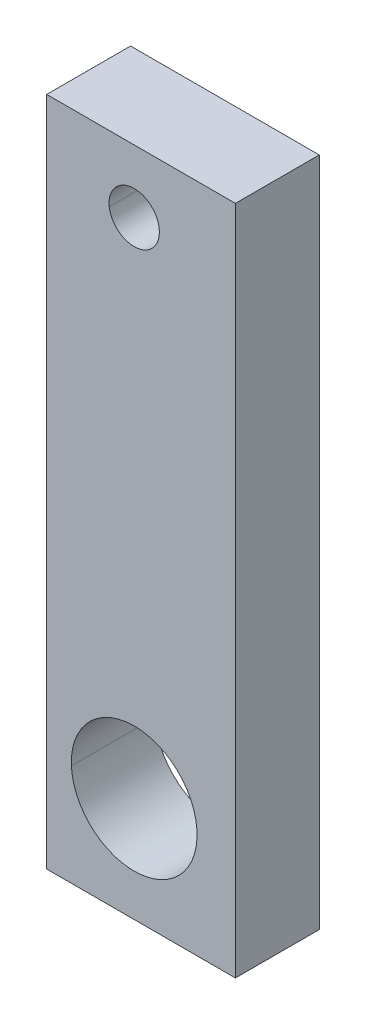
ISO-10303-21;
HEADER;
FILE_DESCRIPTION(('STEP AP214'),'2;1');
FILE_NAME('part.step','',(''),(''),'','','');
FILE_SCHEMA(('AUTOMOTIVE_DESIGN { 1 0 10303 214 1 1 1 1 }'));
ENDSEC;
DATA;
#1=APPLICATION_CONTEXT('core data for automotive mechanical design processes');
#2=APPLICATION_PROTOCOL_DEFINITION('international standard','automotive_design',2000,#1);
#3=PRODUCT_CONTEXT('',#1,'mechanical');
#4=PRODUCT('Part','Part','',(#3));
#5=PRODUCT_RELATED_PRODUCT_CATEGORY('part','',(#4));
#6=PRODUCT_DEFINITION_FORMATION('','',#4);
#7=PRODUCT_DEFINITION_CONTEXT('part definition',#1,'design');
#8=PRODUCT_DEFINITION('design','',#6,#7);
#9=PRODUCT_DEFINITION_SHAPE('','',#8);
#10=(LENGTH_UNIT() NAMED_UNIT(*) SI_UNIT(.MILLI.,.METRE.));
#11=(NAMED_UNIT(*) PLANE_ANGLE_UNIT() SI_UNIT($,.RADIAN.));
#12=(NAMED_UNIT(*) SI_UNIT($,.STERADIAN.) SOLID_ANGLE_UNIT());
#13=UNCERTAINTY_MEASURE_WITH_UNIT(LENGTH_MEASURE(1.E-05),#10,'distance_accuracy_value','');
#14=(GEOMETRIC_REPRESENTATION_CONTEXT(3) GLOBAL_UNCERTAINTY_ASSIGNED_CONTEXT((#13)) GLOBAL_UNIT_ASSIGNED_CONTEXT((#10,
#11,#12)) REPRESENTATION_CONTEXT('',''));
#15=CARTESIAN_POINT('',(0.,0.,0.));
#16=DIRECTION('',(0.,0.,1.));
#17=DIRECTION('',(1.,0.,0.));
#18=AXIS2_PLACEMENT_3D('',#15,#16,#17);
#19=CARTESIAN_POINT('',(20.8621152090657,-135.,20.));
#20=DIRECTION('',(0.,0.,-1.));
#21=DIRECTION('',(-1.,0.,0.));
#22=AXIS2_PLACEMENT_3D('',#19,#20,#21);
#23=CYLINDRICAL_SURFACE('',#22,15.);
#24=CARTESIAN_POINT('',(20.8621152090657,-135.,20.));
#25=DIRECTION('',(0.,0.,1.));
#26=DIRECTION('',(1.,0.,0.));
#27=AXIS2_PLACEMENT_3D('',#24,#25,#26);
#28=CIRCLE('',#27,15.);
#29=CARTESIAN_POINT('',(35.8437607652431,-135.741819674227,20.));
#30=VERTEX_POINT('',#29);
#31=CARTESIAN_POINT('',(5.88046965288826,-135.741819674227,20.));
#32=VERTEX_POINT('',#31);
#33=EDGE_CURVE('E163',#30,#32,#28,.T.);
#34=ORIENTED_EDGE('',*,*,#33,.T.);
#35=DIRECTION('',(0.,0.,-1.));
#36=VECTOR('',#35,1.);
#37=CARTESIAN_POINT('',(5.88046965288826,-135.741819674227,20.));
#38=LINE('',#37,#36);
#39=CARTESIAN_POINT('',(5.88046965288826,-135.741819674227,0.));
#40=VERTEX_POINT('',#39);
#41=EDGE_CURVE('E12',#32,#40,#38,.T.);
#42=ORIENTED_EDGE('',*,*,#41,.T.);
#43=CARTESIAN_POINT('',(20.8621152090657,-135.,0.));
#44=DIRECTION('',(0.,0.,1.));
#45=DIRECTION('',(1.,0.,0.));
#46=AXIS2_PLACEMENT_3D('',#43,#44,#45);
#47=CIRCLE('',#46,15.);
#48=CARTESIAN_POINT('',(35.8437607652431,-135.741819674227,0.));
#49=VERTEX_POINT('',#48);
#50=EDGE_CURVE('E165',#49,#40,#47,.T.);
#51=ORIENTED_EDGE('',*,*,#50,.F.);
#52=DIRECTION('',(0.,0.,-1.));
#53=VECTOR('',#52,1.);
#54=CARTESIAN_POINT('',(35.8437607652431,-135.741819674227,20.));
#55=LINE('',#54,#53);
#56=EDGE_CURVE('E55',#49,#30,#55,.F.);
#57=ORIENTED_EDGE('',*,*,#56,.T.);
#58=EDGE_LOOP('',(#34,#42,#51,#57));
#59=FACE_BOUND('',#58,.T.);
#60=ADVANCED_FACE('F51',(#59),#23,.F.);
#61=CARTESIAN_POINT('',(20.8621152090657,-15.,20.));
#62=DIRECTION('',(0.,0.,-1.));
#63=DIRECTION('',(-1.,0.,0.));
#64=AXIS2_PLACEMENT_3D('',#61,#62,#63);
#65=CYLINDRICAL_SURFACE('',#64,6.);
#66=CARTESIAN_POINT('',(20.8621152090657,-15.,20.));
#67=DIRECTION('',(0.,0.,1.));
#68=DIRECTION('',(1.,0.,0.));
#69=AXIS2_PLACEMENT_3D('',#66,#67,#68);
#70=CIRCLE('',#69,6.);
#71=CARTESIAN_POINT('',(14.9081498437876,-15.7418196742266,20.));
#72=VERTEX_POINT('',#71);
#73=CARTESIAN_POINT('',(26.8160805743437,-15.7418196742266,20.));
#74=VERTEX_POINT('',#73);
#75=EDGE_CURVE('E181',#72,#74,#70,.T.);
#76=ORIENTED_EDGE('',*,*,#75,.T.);
#77=DIRECTION('',(0.,0.,-1.));
#78=VECTOR('',#77,1.);
#79=CARTESIAN_POINT('',(26.8160805743437,-15.7418196742266,20.));
#80=LINE('',#79,#78);
#81=CARTESIAN_POINT('',(26.8160805743437,-15.7418196742266,0.));
#82=VERTEX_POINT('',#81);
#83=EDGE_CURVE('E149',#74,#82,#80,.T.);
#84=ORIENTED_EDGE('',*,*,#83,.T.);
#85=CARTESIAN_POINT('',(20.8621152090657,-15.,0.));
#86=DIRECTION('',(0.,0.,1.));
#87=DIRECTION('',(1.,0.,0.));
#88=AXIS2_PLACEMENT_3D('',#85,#86,#87);
#89=CIRCLE('',#88,6.);
#90=CARTESIAN_POINT('',(14.9081498437876,-15.7418196742266,0.));
#91=VERTEX_POINT('',#90);
#92=EDGE_CURVE('E176',#91,#82,#89,.T.);
#93=ORIENTED_EDGE('',*,*,#92,.F.);
#94=DIRECTION('',(0.,0.,-1.));
#95=VECTOR('',#94,1.);
#96=CARTESIAN_POINT('',(14.9081498437876,-15.7418196742266,20.));
#97=LINE('',#96,#95);
#98=EDGE_CURVE('E145',#91,#72,#97,.F.);
#99=ORIENTED_EDGE('',*,*,#98,.T.);
#100=EDGE_LOOP('',(#76,#84,#93,#99));
#101=FACE_BOUND('',#100,.T.);
#102=ADVANCED_FACE('F226',(#101),#65,.F.);
#103=CARTESIAN_POINT('',(0.,0.,20.));
#104=DIRECTION('',(0.,0.,1.));
#105=DIRECTION('',(1.,0.,0.));
#106=AXIS2_PLACEMENT_3D('',#103,#104,#105);
#107=PLANE('',#106);
#108=ORIENTED_EDGE('',*,*,#75,.F.);
#109=EDGE_CURVE('E183',#74,#72,#70,.T.);
#110=ORIENTED_EDGE('',*,*,#109,.F.);
#111=EDGE_LOOP('',(#108,#110));
#112=FACE_BOUND('',#111,.T.);
#113=DIRECTION('',(0.,-1.,0.));
#114=VECTOR('',#113,1.);
#115=CARTESIAN_POINT('',(0.,0.,20.));
#116=LINE('',#115,#114);
#117=CARTESIAN_POINT('',(0.,0.,20.));
#118=VERTEX_POINT('',#117);
#119=CARTESIAN_POINT('',(0.,-160.,20.));
#120=VERTEX_POINT('',#119);
#121=EDGE_CURVE('E129',#118,#120,#116,.T.);
#122=ORIENTED_EDGE('',*,*,#121,.T.);
#123=DIRECTION('',(1.,0.,0.));
#124=VECTOR('',#123,1.);
#125=CARTESIAN_POINT('',(0.,-160.,20.));
#126=LINE('',#125,#124);
#127=CARTESIAN_POINT('',(45.,-160.,20.));
#128=VERTEX_POINT('',#127);
#129=EDGE_CURVE('E117',#120,#128,#126,.T.);
#130=ORIENTED_EDGE('',*,*,#129,.T.);
#131=DIRECTION('',(0.,1.,0.));
#132=VECTOR('',#131,1.);
#133=CARTESIAN_POINT('',(45.,0.,20.));
#134=LINE('',#133,#132);
#135=CARTESIAN_POINT('',(45.,0.,20.));
#136=VERTEX_POINT('',#135);
#137=EDGE_CURVE('E128',#128,#136,#134,.T.);
#138=ORIENTED_EDGE('',*,*,#137,.T.);
#139=DIRECTION('',(-1.,0.,0.));
#140=VECTOR('',#139,1.);
#141=CARTESIAN_POINT('',(0.,0.,20.));
#142=LINE('',#141,#140);
#143=EDGE_CURVE('E135',#136,#118,#142,.T.);
#144=ORIENTED_EDGE('',*,*,#143,.T.);
#145=EDGE_LOOP('',(#122,#130,#138,#144));
#146=FACE_BOUND('',#145,.T.);
#147=EDGE_CURVE('E167',#32,#30,#28,.T.);
#148=ORIENTED_EDGE('',*,*,#147,.F.);
#149=ORIENTED_EDGE('',*,*,#33,.F.);
#150=EDGE_LOOP('',(#148,#149));
#151=FACE_BOUND('',#150,.T.);
#152=ADVANCED_FACE('F132',(#112,#146,#151),#107,.T.);
#153=CARTESIAN_POINT('',(0.,0.,0.));
#154=DIRECTION('',(0.,0.,1.));
#155=DIRECTION('',(1.,0.,0.));
#156=AXIS2_PLACEMENT_3D('',#153,#154,#155);
#157=PLANE('',#156);
#158=DIRECTION('',(0.,-1.,0.));
#159=VECTOR('',#158,1.);
#160=CARTESIAN_POINT('',(0.,0.,0.));
#161=LINE('',#160,#159);
#162=CARTESIAN_POINT('',(0.,0.,0.));
#163=VERTEX_POINT('',#162);
#164=CARTESIAN_POINT('',(0.,-160.,0.));
#165=VERTEX_POINT('',#164);
#166=EDGE_CURVE('E143',#163,#165,#161,.T.);
#167=ORIENTED_EDGE('',*,*,#166,.F.);
#168=DIRECTION('',(-1.,0.,0.));
#169=VECTOR('',#168,1.);
#170=CARTESIAN_POINT('',(0.,0.,0.));
#171=LINE('',#170,#169);
#172=CARTESIAN_POINT('',(45.,0.,0.));
#173=VERTEX_POINT('',#172);
#174=EDGE_CURVE('E140',#173,#163,#171,.T.);
#175=ORIENTED_EDGE('',*,*,#174,.F.);
#176=DIRECTION('',(0.,1.,0.));
#177=VECTOR('',#176,1.);
#178=CARTESIAN_POINT('',(45.,0.,0.));
#179=LINE('',#178,#177);
#180=CARTESIAN_POINT('',(45.,-160.,0.));
#181=VERTEX_POINT('',#180);
#182=EDGE_CURVE('E198',#181,#173,#179,.T.);
#183=ORIENTED_EDGE('',*,*,#182,.F.);
#184=DIRECTION('',(1.,0.,0.));
#185=VECTOR('',#184,1.);
#186=CARTESIAN_POINT('',(0.,-160.,0.));
#187=LINE('',#186,#185);
#188=EDGE_CURVE('E195',#165,#181,#187,.T.);
#189=ORIENTED_EDGE('',*,*,#188,.F.);
#190=EDGE_LOOP('',(#167,#175,#183,#189));
#191=FACE_BOUND('',#190,.T.);
#192=ORIENTED_EDGE('',*,*,#92,.T.);
#193=EDGE_CURVE('E173',#82,#91,#89,.T.);
#194=ORIENTED_EDGE('',*,*,#193,.T.);
#195=EDGE_LOOP('',(#192,#194));
#196=FACE_BOUND('',#195,.T.);
#197=EDGE_CURVE('E169',#40,#49,#47,.T.);
#198=ORIENTED_EDGE('',*,*,#197,.T.);
#199=ORIENTED_EDGE('',*,*,#50,.T.);
#200=EDGE_LOOP('',(#198,#199));
#201=FACE_BOUND('',#200,.T.);
#202=ADVANCED_FACE('F214',(#191,#196,#201),#157,.F.);
#203=CARTESIAN_POINT('',(0.,0.,20.));
#204=DIRECTION('',(1.,0.,0.));
#205=DIRECTION('',(0.,1.,0.));
#206=AXIS2_PLACEMENT_3D('',#203,#204,#205);
#207=PLANE('',#206);
#208=ORIENTED_EDGE('',*,*,#166,.T.);
#209=DIRECTION('',(0.,0.,-1.));
#210=VECTOR('',#209,1.);
#211=CARTESIAN_POINT('',(0.,-160.,20.));
#212=LINE('',#211,#210);
#213=EDGE_CURVE('E121',#120,#165,#212,.T.);
#214=ORIENTED_EDGE('',*,*,#213,.F.);
#215=ORIENTED_EDGE('',*,*,#121,.F.);
#216=DIRECTION('',(0.,0.,-1.));
#217=VECTOR('',#216,1.);
#218=CARTESIAN_POINT('',(0.,0.,20.));
#219=LINE('',#218,#217);
#220=EDGE_CURVE('E192',#118,#163,#219,.T.);
#221=ORIENTED_EDGE('',*,*,#220,.T.);
#222=EDGE_LOOP('',(#208,#214,#215,#221));
#223=FACE_BOUND('',#222,.T.);
#224=ADVANCED_FACE('F53',(#223),#207,.F.);
#225=CARTESIAN_POINT('',(0.,-160.,20.));
#226=DIRECTION('',(0.,1.,0.));
#227=DIRECTION('',(0.,0.,1.));
#228=AXIS2_PLACEMENT_3D('',#225,#226,#227);
#229=PLANE('',#228);
#230=ORIENTED_EDGE('',*,*,#188,.T.);
#231=DIRECTION('',(0.,0.,-1.));
#232=VECTOR('',#231,1.);
#233=CARTESIAN_POINT('',(45.,-160.,20.));
#234=LINE('',#233,#232);
#235=EDGE_CURVE('E124',#128,#181,#234,.T.);
#236=ORIENTED_EDGE('',*,*,#235,.F.);
#237=ORIENTED_EDGE('',*,*,#129,.F.);
#238=ORIENTED_EDGE('',*,*,#213,.T.);
#239=EDGE_LOOP('',(#230,#236,#237,#238));
#240=FACE_BOUND('',#239,.T.);
#241=ADVANCED_FACE('F119',(#240),#229,.F.);
#242=CARTESIAN_POINT('',(45.,0.,20.));
#243=DIRECTION('',(-1.,0.,0.));
#244=DIRECTION('',(0.,-1.,0.));
#245=AXIS2_PLACEMENT_3D('',#242,#243,#244);
#246=PLANE('',#245);
#247=ORIENTED_EDGE('',*,*,#182,.T.);
#248=DIRECTION('',(0.,0.,-1.));
#249=VECTOR('',#248,1.);
#250=CARTESIAN_POINT('',(45.,0.,20.));
#251=LINE('',#250,#249);
#252=EDGE_CURVE('E151',#136,#173,#251,.T.);
#253=ORIENTED_EDGE('',*,*,#252,.F.);
#254=ORIENTED_EDGE('',*,*,#137,.F.);
#255=ORIENTED_EDGE('',*,*,#235,.T.);
#256=EDGE_LOOP('',(#247,#253,#254,#255));
#257=FACE_BOUND('',#256,.T.);
#258=ADVANCED_FACE('F216',(#257),#246,.F.);
#259=CARTESIAN_POINT('',(0.,0.,20.));
#260=DIRECTION('',(0.,-1.,0.));
#261=DIRECTION('',(0.,0.,-1.));
#262=AXIS2_PLACEMENT_3D('',#259,#260,#261);
#263=PLANE('',#262);
#264=ORIENTED_EDGE('',*,*,#174,.T.);
#265=ORIENTED_EDGE('',*,*,#220,.F.);
#266=ORIENTED_EDGE('',*,*,#143,.F.);
#267=ORIENTED_EDGE('',*,*,#252,.T.);
#268=EDGE_LOOP('',(#264,#265,#266,#267));
#269=FACE_BOUND('',#268,.T.);
#270=ADVANCED_FACE('F210',(#269),#263,.F.);
#271=ORIENTED_EDGE('',*,*,#83,.F.);
#272=ORIENTED_EDGE('',*,*,#109,.T.);
#273=ORIENTED_EDGE('',*,*,#98,.F.);
#274=ORIENTED_EDGE('',*,*,#193,.F.);
#275=EDGE_LOOP('',(#271,#272,#273,#274));
#276=FACE_BOUND('',#275,.T.);
#277=ADVANCED_FACE('F223',(#276),#65,.F.);
#278=ORIENTED_EDGE('',*,*,#41,.F.);
#279=ORIENTED_EDGE('',*,*,#147,.T.);
#280=ORIENTED_EDGE('',*,*,#56,.F.);
#281=ORIENTED_EDGE('',*,*,#197,.F.);
#282=EDGE_LOOP('',(#278,#279,#280,#281));
#283=FACE_BOUND('',#282,.T.);
#284=ADVANCED_FACE('F171',(#283),#23,.F.);
#285=CLOSED_SHELL('',(#60,#102,#152,#202,#224,#241,#258,#270,#277,#284));
#286=MANIFOLD_SOLID_BREP('B2',#285);
#287=ADVANCED_BREP_SHAPE_REPRESENTATION('',(#18,#286),#14);
#288=SHAPE_DEFINITION_REPRESENTATION(#9,#287);
ENDSEC;
END-ISO-10303-21;
